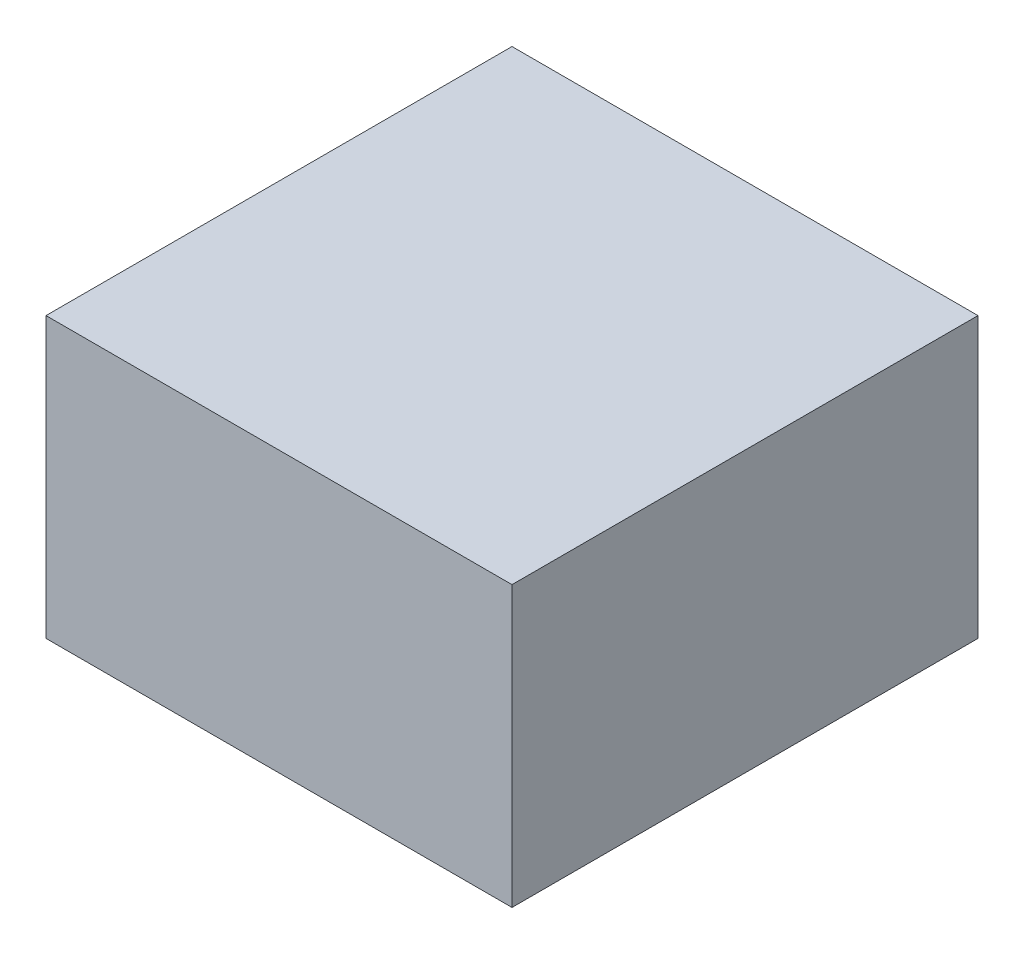
ISO-10303-21;
HEADER;
FILE_DESCRIPTION(('STEP AP214'),'2;1');
FILE_NAME('part.step','',(''),(''),'','','');
FILE_SCHEMA(('AUTOMOTIVE_DESIGN { 1 0 10303 214 1 1 1 1 }'));
ENDSEC;
DATA;
#1=APPLICATION_CONTEXT('core data for automotive mechanical design processes');
#2=APPLICATION_PROTOCOL_DEFINITION('international standard','automotive_design',2000,#1);
#3=PRODUCT_CONTEXT('',#1,'mechanical');
#4=PRODUCT('Part','Part','',(#3));
#5=PRODUCT_RELATED_PRODUCT_CATEGORY('part','',(#4));
#6=PRODUCT_DEFINITION_FORMATION('','',#4);
#7=PRODUCT_DEFINITION_CONTEXT('part definition',#1,'design');
#8=PRODUCT_DEFINITION('design','',#6,#7);
#9=PRODUCT_DEFINITION_SHAPE('','',#8);
#10=(LENGTH_UNIT() NAMED_UNIT(*) SI_UNIT(.MILLI.,.METRE.));
#11=(NAMED_UNIT(*) PLANE_ANGLE_UNIT() SI_UNIT($,.RADIAN.));
#12=(NAMED_UNIT(*) SI_UNIT($,.STERADIAN.) SOLID_ANGLE_UNIT());
#13=UNCERTAINTY_MEASURE_WITH_UNIT(LENGTH_MEASURE(1.E-05),#10,'distance_accuracy_value','');
#14=(GEOMETRIC_REPRESENTATION_CONTEXT(3) GLOBAL_UNCERTAINTY_ASSIGNED_CONTEXT((#13)) GLOBAL_UNIT_ASSIGNED_CONTEXT((#10,
#11,#12)) REPRESENTATION_CONTEXT('',''));
#15=CARTESIAN_POINT('',(0.,0.,0.));
#16=DIRECTION('',(0.,0.,1.));
#17=DIRECTION('',(1.,0.,0.));
#18=AXIS2_PLACEMENT_3D('',#15,#16,#17);
#19=CARTESIAN_POINT('',(0.,3.,0.));
#20=DIRECTION('',(1.,0.,0.));
#21=DIRECTION('',(0.,0.,-1.));
#22=AXIS2_PLACEMENT_3D('',#19,#20,#21);
#23=PLANE('',#22);
#24=DIRECTION('',(0.,0.,1.));
#25=VECTOR('',#24,1.);
#26=CARTESIAN_POINT('',(0.,0.,0.));
#27=LINE('',#26,#25);
#28=CARTESIAN_POINT('',(0.,0.,0.));
#29=VERTEX_POINT('',#28);
#30=CARTESIAN_POINT('',(0.,0.,5.));
#31=VERTEX_POINT('',#30);
#32=EDGE_CURVE('E99',#29,#31,#27,.T.);
#33=ORIENTED_EDGE('',*,*,#32,.T.);
#34=DIRECTION('',(0.,-1.,0.));
#35=VECTOR('',#34,1.);
#36=CARTESIAN_POINT('',(0.,3.,5.));
#37=LINE('',#36,#35);
#38=CARTESIAN_POINT('',(0.,3.,5.));
#39=VERTEX_POINT('',#38);
#40=EDGE_CURVE('E11',#39,#31,#37,.T.);
#41=ORIENTED_EDGE('',*,*,#40,.F.);
#42=DIRECTION('',(0.,0.,1.));
#43=VECTOR('',#42,1.);
#44=CARTESIAN_POINT('',(0.,3.,0.));
#45=LINE('',#44,#43);
#46=CARTESIAN_POINT('',(0.,3.,0.));
#47=VERTEX_POINT('',#46);
#48=EDGE_CURVE('E87',#47,#39,#45,.T.);
#49=ORIENTED_EDGE('',*,*,#48,.F.);
#50=DIRECTION('',(0.,-1.,0.));
#51=VECTOR('',#50,1.);
#52=CARTESIAN_POINT('',(0.,3.,0.));
#53=LINE('',#52,#51);
#54=EDGE_CURVE('E95',#47,#29,#53,.T.);
#55=ORIENTED_EDGE('',*,*,#54,.T.);
#56=EDGE_LOOP('',(#33,#41,#49,#55));
#57=FACE_BOUND('',#56,.T.);
#58=ADVANCED_FACE('F36',(#57),#23,.F.);
#59=CARTESIAN_POINT('',(0.,3.,5.));
#60=DIRECTION('',(0.,0.,-1.));
#61=DIRECTION('',(-1.,0.,0.));
#62=AXIS2_PLACEMENT_3D('',#59,#60,#61);
#63=PLANE('',#62);
#64=DIRECTION('',(1.,0.,0.));
#65=VECTOR('',#64,1.);
#66=CARTESIAN_POINT('',(0.,0.,5.));
#67=LINE('',#66,#65);
#68=CARTESIAN_POINT('',(5.,0.,5.));
#69=VERTEX_POINT('',#68);
#70=EDGE_CURVE('E91',#31,#69,#67,.T.);
#71=ORIENTED_EDGE('',*,*,#70,.T.);
#72=DIRECTION('',(0.,-1.,0.));
#73=VECTOR('',#72,1.);
#74=CARTESIAN_POINT('',(5.,3.,5.));
#75=LINE('',#74,#73);
#76=CARTESIAN_POINT('',(5.,3.,5.));
#77=VERTEX_POINT('',#76);
#78=EDGE_CURVE('E44',#77,#69,#75,.T.);
#79=ORIENTED_EDGE('',*,*,#78,.F.);
#80=DIRECTION('',(1.,0.,0.));
#81=VECTOR('',#80,1.);
#82=CARTESIAN_POINT('',(0.,3.,5.));
#83=LINE('',#82,#81);
#84=EDGE_CURVE('E82',#39,#77,#83,.T.);
#85=ORIENTED_EDGE('',*,*,#84,.F.);
#86=ORIENTED_EDGE('',*,*,#40,.T.);
#87=EDGE_LOOP('',(#71,#79,#85,#86));
#88=FACE_BOUND('',#87,.T.);
#89=ADVANCED_FACE('F90',(#88),#63,.F.);
#90=CARTESIAN_POINT('',(5.,3.,0.));
#91=DIRECTION('',(-1.,0.,0.));
#92=DIRECTION('',(0.,0.,1.));
#93=AXIS2_PLACEMENT_3D('',#90,#91,#92);
#94=PLANE('',#93);
#95=DIRECTION('',(0.,0.,-1.));
#96=VECTOR('',#95,1.);
#97=CARTESIAN_POINT('',(5.,0.,0.));
#98=LINE('',#97,#96);
#99=CARTESIAN_POINT('',(5.,0.,0.));
#100=VERTEX_POINT('',#99);
#101=EDGE_CURVE('E69',#69,#100,#98,.T.);
#102=ORIENTED_EDGE('',*,*,#101,.T.);
#103=DIRECTION('',(0.,-1.,0.));
#104=VECTOR('',#103,1.);
#105=CARTESIAN_POINT('',(5.,3.,0.));
#106=LINE('',#105,#104);
#107=CARTESIAN_POINT('',(5.,3.,0.));
#108=VERTEX_POINT('',#107);
#109=EDGE_CURVE('E92',#108,#100,#106,.T.);
#110=ORIENTED_EDGE('',*,*,#109,.F.);
#111=DIRECTION('',(0.,0.,-1.));
#112=VECTOR('',#111,1.);
#113=CARTESIAN_POINT('',(5.,3.,0.));
#114=LINE('',#113,#112);
#115=EDGE_CURVE('E85',#77,#108,#114,.T.);
#116=ORIENTED_EDGE('',*,*,#115,.F.);
#117=ORIENTED_EDGE('',*,*,#78,.T.);
#118=EDGE_LOOP('',(#102,#110,#116,#117));
#119=FACE_BOUND('',#118,.T.);
#120=ADVANCED_FACE('F93',(#119),#94,.F.);
#121=CARTESIAN_POINT('',(0.,3.,0.));
#122=DIRECTION('',(0.,0.,1.));
#123=DIRECTION('',(1.,0.,0.));
#124=AXIS2_PLACEMENT_3D('',#121,#122,#123);
#125=PLANE('',#124);
#126=DIRECTION('',(-1.,0.,0.));
#127=VECTOR('',#126,1.);
#128=CARTESIAN_POINT('',(0.,0.,0.));
#129=LINE('',#128,#127);
#130=EDGE_CURVE('E75',#100,#29,#129,.T.);
#131=ORIENTED_EDGE('',*,*,#130,.T.);
#132=ORIENTED_EDGE('',*,*,#54,.F.);
#133=DIRECTION('',(-1.,0.,0.));
#134=VECTOR('',#133,1.);
#135=CARTESIAN_POINT('',(0.,3.,0.));
#136=LINE('',#135,#134);
#137=EDGE_CURVE('E52',#108,#47,#136,.T.);
#138=ORIENTED_EDGE('',*,*,#137,.F.);
#139=ORIENTED_EDGE('',*,*,#109,.T.);
#140=EDGE_LOOP('',(#131,#132,#138,#139));
#141=FACE_BOUND('',#140,.T.);
#142=ADVANCED_FACE('F106',(#141),#125,.F.);
#143=CARTESIAN_POINT('',(0.,3.,0.));
#144=DIRECTION('',(0.,1.,0.));
#145=DIRECTION('',(0.,0.,1.));
#146=AXIS2_PLACEMENT_3D('',#143,#144,#145);
#147=PLANE('',#146);
#148=ORIENTED_EDGE('',*,*,#48,.T.);
#149=ORIENTED_EDGE('',*,*,#84,.T.);
#150=ORIENTED_EDGE('',*,*,#115,.T.);
#151=ORIENTED_EDGE('',*,*,#137,.T.);
#152=EDGE_LOOP('',(#148,#149,#150,#151));
#153=FACE_BOUND('',#152,.T.);
#154=ADVANCED_FACE('F83',(#153),#147,.T.);
#155=CARTESIAN_POINT('',(0.,0.,0.));
#156=DIRECTION('',(0.,1.,0.));
#157=DIRECTION('',(0.,0.,1.));
#158=AXIS2_PLACEMENT_3D('',#155,#156,#157);
#159=PLANE('',#158);
#160=ORIENTED_EDGE('',*,*,#32,.F.);
#161=ORIENTED_EDGE('',*,*,#130,.F.);
#162=ORIENTED_EDGE('',*,*,#101,.F.);
#163=ORIENTED_EDGE('',*,*,#70,.F.);
#164=EDGE_LOOP('',(#160,#161,#162,#163));
#165=FACE_BOUND('',#164,.T.);
#166=ADVANCED_FACE('F109',(#165),#159,.F.);
#167=CLOSED_SHELL('',(#58,#89,#120,#142,#154,#166));
#168=MANIFOLD_SOLID_BREP('B2',#167);
#169=ADVANCED_BREP_SHAPE_REPRESENTATION('',(#18,#168),#14);
#170=SHAPE_DEFINITION_REPRESENTATION(#9,#169);
ENDSEC;
END-ISO-10303-21;
